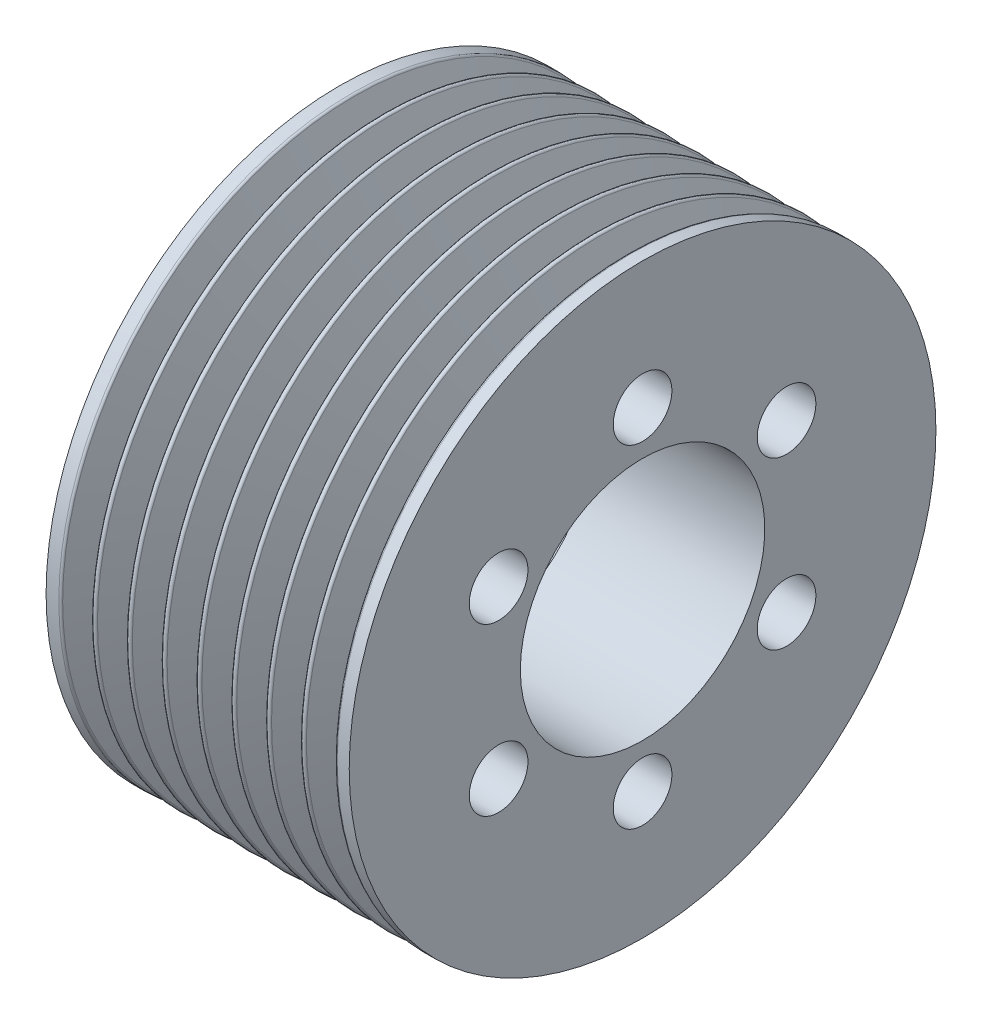
ISO-10303-21;
HEADER;
FILE_DESCRIPTION(('STEP AP214'),'2;1');
FILE_NAME('part.step','',(''),(''),'','','');
FILE_SCHEMA(('AUTOMOTIVE_DESIGN { 1 0 10303 214 1 1 1 1 }'));
ENDSEC;
DATA;
#1=APPLICATION_CONTEXT('core data for automotive mechanical design processes');
#2=APPLICATION_PROTOCOL_DEFINITION('international standard','automotive_design',2000,#1);
#3=PRODUCT_CONTEXT('',#1,'mechanical');
#4=PRODUCT('Part','Part','',(#3));
#5=PRODUCT_RELATED_PRODUCT_CATEGORY('part','',(#4));
#6=PRODUCT_DEFINITION_FORMATION('','',#4);
#7=PRODUCT_DEFINITION_CONTEXT('part definition',#1,'design');
#8=PRODUCT_DEFINITION('design','',#6,#7);
#9=PRODUCT_DEFINITION_SHAPE('','',#8);
#10=(LENGTH_UNIT() NAMED_UNIT(*) SI_UNIT(.MILLI.,.METRE.));
#11=(NAMED_UNIT(*) PLANE_ANGLE_UNIT() SI_UNIT($,.RADIAN.));
#12=(NAMED_UNIT(*) SI_UNIT($,.STERADIAN.) SOLID_ANGLE_UNIT());
#13=UNCERTAINTY_MEASURE_WITH_UNIT(LENGTH_MEASURE(1.E-05),#10,'distance_accuracy_value','');
#14=(GEOMETRIC_REPRESENTATION_CONTEXT(3) GLOBAL_UNCERTAINTY_ASSIGNED_CONTEXT((#13)) GLOBAL_UNIT_ASSIGNED_CONTEXT((#10,
#11,#12)) REPRESENTATION_CONTEXT('',''));
#15=CARTESIAN_POINT('',(0.,0.,0.));
#16=DIRECTION('',(0.,0.,1.));
#17=DIRECTION('',(1.,0.,0.));
#18=AXIS2_PLACEMENT_3D('',#15,#16,#17);
#19=CARTESIAN_POINT('',(0.,0.,0.));
#20=DIRECTION('',(-1.,0.,0.));
#21=DIRECTION('',(0.,0.,1.));
#22=AXIS2_PLACEMENT_3D('',#19,#20,#21);
#23=CYLINDRICAL_SURFACE('',#22,30.);
#24=CARTESIAN_POINT('',(18.,0.,0.));
#25=DIRECTION('',(-1.,0.,0.));
#26=DIRECTION('',(0.,0.,1.));
#27=AXIS2_PLACEMENT_3D('',#24,#25,#26);
#28=CIRCLE('',#27,30.);
#29=CARTESIAN_POINT('',(18.,0.,30.));
#30=VERTEX_POINT('',#29);
#31=EDGE_CURVE('E59',#30,#30,#28,.T.);
#32=ORIENTED_EDGE('',*,*,#31,.F.);
#33=EDGE_LOOP('',(#32));
#34=FACE_BOUND('',#33,.T.);
#35=CARTESIAN_POINT('',(19.3,0.,0.));
#36=DIRECTION('',(-1.,0.,0.));
#37=DIRECTION('',(0.,0.,1.));
#38=AXIS2_PLACEMENT_3D('',#35,#36,#37);
#39=CIRCLE('',#38,30.);
#40=CARTESIAN_POINT('',(19.3,0.,30.));
#41=VERTEX_POINT('',#40);
#42=EDGE_CURVE('E210',#41,#41,#39,.T.);
#43=ORIENTED_EDGE('',*,*,#42,.T.);
#44=EDGE_LOOP('',(#43));
#45=FACE_BOUND('',#44,.T.);
#46=ADVANCED_FACE('F45',(#34,#45),#23,.T.);
#47=CARTESIAN_POINT('',(31.5,12.5,0.));
#48=DIRECTION('',(1.,0.,0.));
#49=DIRECTION('',(0.,0.,-1.));
#50=AXIS2_PLACEMENT_3D('',#47,#48,#49);
#51=PLANE('',#50);
#52=CARTESIAN_POINT('',(31.5,8.50000000000017,14.7224318643354));
#53=DIRECTION('',(1.,0.,0.));
#54=DIRECTION('',(0.,0.,-1.));
#55=AXIS2_PLACEMENT_3D('',#52,#53,#54);
#56=CIRCLE('',#55,3.);
#57=CARTESIAN_POINT('',(31.5,8.50000000000017,11.7224318643354));
#58=VERTEX_POINT('',#57);
#59=EDGE_CURVE('E254',#58,#58,#56,.F.);
#60=ORIENTED_EDGE('',*,*,#59,.F.);
#61=EDGE_LOOP('',(#60));
#62=FACE_BOUND('',#61,.T.);
#63=CARTESIAN_POINT('',(31.5,-8.50000000000004,14.7224318643355));
#64=DIRECTION('',(1.,0.,0.));
#65=DIRECTION('',(0.,0.,-1.));
#66=AXIS2_PLACEMENT_3D('',#63,#64,#65);
#67=CIRCLE('',#66,3.);
#68=CARTESIAN_POINT('',(31.5,-8.50000000000004,11.7224318643355));
#69=VERTEX_POINT('',#68);
#70=EDGE_CURVE('E246',#69,#69,#67,.F.);
#71=ORIENTED_EDGE('',*,*,#70,.F.);
#72=EDGE_LOOP('',(#71));
#73=FACE_BOUND('',#72,.T.);
#74=CARTESIAN_POINT('',(31.5,-17.0000000000001,0.));
#75=DIRECTION('',(1.,0.,0.));
#76=DIRECTION('',(0.,0.,-1.));
#77=AXIS2_PLACEMENT_3D('',#74,#75,#76);
#78=CIRCLE('',#77,3.);
#79=CARTESIAN_POINT('',(31.5,-17.0000000000001,-2.99999999999996));
#80=VERTEX_POINT('',#79);
#81=EDGE_CURVE('E238',#80,#80,#78,.F.);
#82=ORIENTED_EDGE('',*,*,#81,.F.);
#83=EDGE_LOOP('',(#82));
#84=FACE_BOUND('',#83,.T.);
#85=CARTESIAN_POINT('',(31.5,-8.49999999999999,-14.7224318643355));
#86=DIRECTION('',(1.,0.,0.));
#87=DIRECTION('',(0.,0.,-1.));
#88=AXIS2_PLACEMENT_3D('',#85,#86,#87);
#89=CIRCLE('',#88,3.);
#90=CARTESIAN_POINT('',(31.5,-8.49999999999999,-17.7224318643355));
#91=VERTEX_POINT('',#90);
#92=EDGE_CURVE('E230',#91,#91,#89,.F.);
#93=ORIENTED_EDGE('',*,*,#92,.F.);
#94=EDGE_LOOP('',(#93));
#95=FACE_BOUND('',#94,.T.);
#96=CARTESIAN_POINT('',(31.5,8.5,-14.7224318643355));
#97=DIRECTION('',(1.,0.,0.));
#98=DIRECTION('',(0.,0.,-1.));
#99=AXIS2_PLACEMENT_3D('',#96,#97,#98);
#100=CIRCLE('',#99,3.);
#101=CARTESIAN_POINT('',(31.5,8.5,-17.7224318643355));
#102=VERTEX_POINT('',#101);
#103=EDGE_CURVE('E222',#102,#102,#100,.F.);
#104=ORIENTED_EDGE('',*,*,#103,.F.);
#105=EDGE_LOOP('',(#104));
#106=FACE_BOUND('',#105,.T.);
#107=CARTESIAN_POINT('',(31.5,17.,0.));
#108=DIRECTION('',(1.,0.,0.));
#109=DIRECTION('',(0.,0.,-1.));
#110=AXIS2_PLACEMENT_3D('',#107,#108,#109);
#111=CIRCLE('',#110,3.);
#112=CARTESIAN_POINT('',(31.5,17.,-3.));
#113=VERTEX_POINT('',#112);
#114=EDGE_CURVE('E214',#113,#113,#111,.F.);
#115=ORIENTED_EDGE('',*,*,#114,.F.);
#116=EDGE_LOOP('',(#115));
#117=FACE_BOUND('',#116,.T.);
#118=CARTESIAN_POINT('',(31.5,0.,0.));
#119=DIRECTION('',(-1.,0.,0.));
#120=DIRECTION('',(0.,0.,1.));
#121=AXIS2_PLACEMENT_3D('',#118,#119,#120);
#122=CIRCLE('',#121,12.5);
#123=CARTESIAN_POINT('',(31.5,0.,12.5));
#124=VERTEX_POINT('',#123);
#125=EDGE_CURVE('E74',#124,#124,#122,.T.);
#126=ORIENTED_EDGE('',*,*,#125,.F.);
#127=EDGE_LOOP('',(#126));
#128=FACE_BOUND('',#127,.T.);
#129=CARTESIAN_POINT('',(31.5,0.,0.));
#130=DIRECTION('',(-1.,0.,0.));
#131=DIRECTION('',(0.,0.,1.));
#132=AXIS2_PLACEMENT_3D('',#129,#130,#131);
#133=CIRCLE('',#132,21.5);
#134=CARTESIAN_POINT('',(31.5,0.,21.5));
#135=VERTEX_POINT('',#134);
#136=EDGE_CURVE('E10',#135,#135,#133,.T.);
#137=ORIENTED_EDGE('',*,*,#136,.T.);
#138=EDGE_LOOP('',(#137));
#139=FACE_BOUND('',#138,.T.);
#140=ADVANCED_FACE('F48',(#62,#73,#84,#95,#106,#117,#128,#139),#51,.F.);
#141=CARTESIAN_POINT('',(0.,0.,0.));
#142=DIRECTION('',(-1.,0.,0.));
#143=DIRECTION('',(0.,0.,1.));
#144=AXIS2_PLACEMENT_3D('',#141,#142,#143);
#145=CYLINDRICAL_SURFACE('',#144,21.5);
#146=ORIENTED_EDGE('',*,*,#136,.F.);
#147=EDGE_LOOP('',(#146));
#148=FACE_BOUND('',#147,.T.);
#149=CARTESIAN_POINT('',(18.,0.,0.));
#150=DIRECTION('',(-1.,0.,0.));
#151=DIRECTION('',(0.,0.,1.));
#152=AXIS2_PLACEMENT_3D('',#149,#150,#151);
#153=CIRCLE('',#152,21.5);
#154=CARTESIAN_POINT('',(18.,0.,21.5));
#155=VERTEX_POINT('',#154);
#156=EDGE_CURVE('E54',#155,#155,#153,.T.);
#157=ORIENTED_EDGE('',*,*,#156,.T.);
#158=EDGE_LOOP('',(#157));
#159=FACE_BOUND('',#158,.T.);
#160=ADVANCED_FACE('F292',(#148,#159),#145,.F.);
#161=CARTESIAN_POINT('',(18.,30.,0.));
#162=DIRECTION('',(1.,0.,0.));
#163=DIRECTION('',(0.,0.,-1.));
#164=AXIS2_PLACEMENT_3D('',#161,#162,#163);
#165=PLANE('',#164);
#166=ORIENTED_EDGE('',*,*,#156,.F.);
#167=EDGE_LOOP('',(#166));
#168=FACE_BOUND('',#167,.T.);
#169=ORIENTED_EDGE('',*,*,#31,.T.);
#170=EDGE_LOOP('',(#169));
#171=FACE_BOUND('',#170,.T.);
#172=ADVANCED_FACE('F298',(#168,#171),#165,.F.);
#173=CARTESIAN_POINT('',(47.78,0.,0.));
#174=DIRECTION('',(-1.,0.,0.));
#175=DIRECTION('',(0.,0.,1.));
#176=AXIS2_PLACEMENT_3D('',#173,#174,#175);
#177=CIRCLE('',#176,30.);
#178=CARTESIAN_POINT('',(47.78,0.,30.));
#179=VERTEX_POINT('',#178);
#180=EDGE_CURVE('E94',#179,#179,#177,.T.);
#181=ORIENTED_EDGE('',*,*,#180,.F.);
#182=EDGE_LOOP('',(#181));
#183=FACE_BOUND('',#182,.T.);
#184=CARTESIAN_POINT('',(49.,0.,0.));
#185=DIRECTION('',(-1.,0.,0.));
#186=DIRECTION('',(0.,0.,1.));
#187=AXIS2_PLACEMENT_3D('',#184,#185,#186);
#188=CIRCLE('',#187,30.);
#189=CARTESIAN_POINT('',(49.,0.,30.));
#190=VERTEX_POINT('',#189);
#191=EDGE_CURVE('E64',#190,#190,#188,.T.);
#192=ORIENTED_EDGE('',*,*,#191,.T.);
#193=EDGE_LOOP('',(#192));
#194=FACE_BOUND('',#193,.T.);
#195=ADVANCED_FACE('F269',(#183,#194),#23,.T.);
#196=CARTESIAN_POINT('',(49.,12.5,0.));
#197=DIRECTION('',(-1.,0.,0.));
#198=DIRECTION('',(0.,0.,1.));
#199=AXIS2_PLACEMENT_3D('',#196,#197,#198);
#200=PLANE('',#199);
#201=CARTESIAN_POINT('',(49.,8.50000000000017,14.7224318643354));
#202=DIRECTION('',(1.,0.,0.));
#203=DIRECTION('',(0.,0.,-1.));
#204=AXIS2_PLACEMENT_3D('',#201,#202,#203);
#205=CIRCLE('',#204,3.);
#206=CARTESIAN_POINT('',(49.,8.50000000000017,11.7224318643354));
#207=VERTEX_POINT('',#206);
#208=EDGE_CURVE('E258',#207,#207,#205,.T.);
#209=ORIENTED_EDGE('',*,*,#208,.F.);
#210=EDGE_LOOP('',(#209));
#211=FACE_BOUND('',#210,.T.);
#212=CARTESIAN_POINT('',(49.,-8.50000000000004,14.7224318643355));
#213=DIRECTION('',(1.,0.,0.));
#214=DIRECTION('',(0.,0.,-1.));
#215=AXIS2_PLACEMENT_3D('',#212,#213,#214);
#216=CIRCLE('',#215,3.);
#217=CARTESIAN_POINT('',(49.,-8.50000000000004,11.7224318643355));
#218=VERTEX_POINT('',#217);
#219=EDGE_CURVE('E250',#218,#218,#216,.T.);
#220=ORIENTED_EDGE('',*,*,#219,.F.);
#221=EDGE_LOOP('',(#220));
#222=FACE_BOUND('',#221,.T.);
#223=CARTESIAN_POINT('',(49.,-17.0000000000001,0.));
#224=DIRECTION('',(1.,0.,0.));
#225=DIRECTION('',(0.,0.,-1.));
#226=AXIS2_PLACEMENT_3D('',#223,#224,#225);
#227=CIRCLE('',#226,3.);
#228=CARTESIAN_POINT('',(49.,-17.0000000000001,-2.99999999999996));
#229=VERTEX_POINT('',#228);
#230=EDGE_CURVE('E242',#229,#229,#227,.T.);
#231=ORIENTED_EDGE('',*,*,#230,.F.);
#232=EDGE_LOOP('',(#231));
#233=FACE_BOUND('',#232,.T.);
#234=CARTESIAN_POINT('',(49.,-8.49999999999999,-14.7224318643355));
#235=DIRECTION('',(1.,0.,0.));
#236=DIRECTION('',(0.,0.,-1.));
#237=AXIS2_PLACEMENT_3D('',#234,#235,#236);
#238=CIRCLE('',#237,3.);
#239=CARTESIAN_POINT('',(49.,-8.49999999999999,-17.7224318643355));
#240=VERTEX_POINT('',#239);
#241=EDGE_CURVE('E234',#240,#240,#238,.T.);
#242=ORIENTED_EDGE('',*,*,#241,.F.);
#243=EDGE_LOOP('',(#242));
#244=FACE_BOUND('',#243,.T.);
#245=CARTESIAN_POINT('',(49.,8.5,-14.7224318643355));
#246=DIRECTION('',(1.,0.,0.));
#247=DIRECTION('',(0.,0.,-1.));
#248=AXIS2_PLACEMENT_3D('',#245,#246,#247);
#249=CIRCLE('',#248,3.);
#250=CARTESIAN_POINT('',(49.,8.5,-17.7224318643355));
#251=VERTEX_POINT('',#250);
#252=EDGE_CURVE('E226',#251,#251,#249,.T.);
#253=ORIENTED_EDGE('',*,*,#252,.F.);
#254=EDGE_LOOP('',(#253));
#255=FACE_BOUND('',#254,.T.);
#256=CARTESIAN_POINT('',(49.,17.,0.));
#257=DIRECTION('',(1.,0.,0.));
#258=DIRECTION('',(0.,0.,-1.));
#259=AXIS2_PLACEMENT_3D('',#256,#257,#258);
#260=CIRCLE('',#259,3.);
#261=CARTESIAN_POINT('',(49.,17.,-3.));
#262=VERTEX_POINT('',#261);
#263=EDGE_CURVE('E218',#262,#262,#260,.T.);
#264=ORIENTED_EDGE('',*,*,#263,.F.);
#265=EDGE_LOOP('',(#264));
#266=FACE_BOUND('',#265,.T.);
#267=ORIENTED_EDGE('',*,*,#191,.F.);
#268=EDGE_LOOP('',(#267));
#269=FACE_BOUND('',#268,.T.);
#270=CARTESIAN_POINT('',(49.,0.,0.));
#271=DIRECTION('',(-1.,0.,0.));
#272=DIRECTION('',(0.,0.,1.));
#273=AXIS2_PLACEMENT_3D('',#270,#271,#272);
#274=CIRCLE('',#273,12.5);
#275=CARTESIAN_POINT('',(49.,0.,12.5));
#276=VERTEX_POINT('',#275);
#277=EDGE_CURVE('E70',#276,#276,#274,.T.);
#278=ORIENTED_EDGE('',*,*,#277,.T.);
#279=EDGE_LOOP('',(#278));
#280=FACE_BOUND('',#279,.T.);
#281=ADVANCED_FACE('F265',(#211,#222,#233,#244,#255,#266,#269,#280),#200,.F.);
#282=CARTESIAN_POINT('',(0.,0.,0.));
#283=DIRECTION('',(-1.,0.,0.));
#284=DIRECTION('',(0.,0.,1.));
#285=AXIS2_PLACEMENT_3D('',#282,#283,#284);
#286=CYLINDRICAL_SURFACE('',#285,12.5);
#287=ORIENTED_EDGE('',*,*,#277,.F.);
#288=EDGE_LOOP('',(#287));
#289=FACE_BOUND('',#288,.T.);
#290=ORIENTED_EDGE('',*,*,#125,.T.);
#291=EDGE_LOOP('',(#290));
#292=FACE_BOUND('',#291,.T.);
#293=ADVANCED_FACE('F268',(#289,#292),#286,.F.);
#294=CARTESIAN_POINT('',(47.78,0.,0.));
#295=DIRECTION('',(-1.,0.,0.));
#296=DIRECTION('',(0.,0.,1.));
#297=AXIS2_PLACEMENT_3D('',#294,#295,#296);
#298=TOROIDAL_SURFACE('',#297,29.75,0.249999999999997);
#299=ORIENTED_EDGE('',*,*,#180,.T.);
#300=EDGE_LOOP('',(#299));
#301=FACE_BOUND('',#300,.T.);
#302=CARTESIAN_POINT('',(47.5458319526879,0.,0.));
#303=DIRECTION('',(-1.,0.,0.));
#304=DIRECTION('',(0.,0.,1.));
#305=AXIS2_PLACEMENT_3D('',#302,#303,#304);
#306=CIRCLE('',#305,29.8375518453149);
#307=CARTESIAN_POINT('',(47.5458319526879,0.,29.8375518453149));
#308=VERTEX_POINT('',#307);
#309=EDGE_CURVE('E78',#308,#308,#306,.T.);
#310=ORIENTED_EDGE('',*,*,#309,.F.);
#311=EDGE_LOOP('',(#310));
#312=FACE_BOUND('',#311,.T.);
#313=ADVANCED_FACE('F287',(#301,#312),#298,.T.);
#314=CARTESIAN_POINT('',(46.2810016567745,0.,0.));
#315=DIRECTION('',(1.,0.,0.));
#316=DIRECTION('',(0.,0.,-1.));
#317=AXIS2_PLACEMENT_3D('',#314,#315,#316);
#318=CONICAL_SURFACE('',#317,26.4546095496951,1.21300383013606);
#319=ORIENTED_EDGE('',*,*,#309,.T.);
#320=EDGE_LOOP('',(#319));
#321=FACE_BOUND('',#320,.T.);
#322=CARTESIAN_POINT('',(46.2810016567745,0.,0.));
#323=DIRECTION('',(-1.,0.,0.));
#324=DIRECTION('',(0.,0.,1.));
#325=AXIS2_PLACEMENT_3D('',#322,#323,#324);
#326=CIRCLE('',#325,26.4546095496951);
#327=CARTESIAN_POINT('',(46.2810016567745,0.,26.4546095496951));
#328=VERTEX_POINT('',#327);
#329=EDGE_CURVE('E82',#328,#328,#326,.T.);
#330=ORIENTED_EDGE('',*,*,#329,.F.);
#331=EDGE_LOOP('',(#330));
#332=FACE_BOUND('',#331,.T.);
#333=ADVANCED_FACE('F484',(#321,#332),#318,.T.);
#334=CARTESIAN_POINT('',(46.,0.,0.));
#335=DIRECTION('',(-1.,0.,0.));
#336=DIRECTION('',(0.,0.,1.));
#337=AXIS2_PLACEMENT_3D('',#334,#335,#336);
#338=TOROIDAL_SURFACE('',#337,26.5596717640729,0.300000000000001);
#339=ORIENTED_EDGE('',*,*,#329,.T.);
#340=EDGE_LOOP('',(#339));
#341=FACE_BOUND('',#340,.T.);
#342=CARTESIAN_POINT('',(45.7189983432255,0.,0.));
#343=DIRECTION('',(-1.,0.,0.));
#344=DIRECTION('',(0.,0.,1.));
#345=AXIS2_PLACEMENT_3D('',#342,#343,#344);
#346=CIRCLE('',#345,26.4546095496951);
#347=CARTESIAN_POINT('',(45.7189983432255,0.,26.4546095496951));
#348=VERTEX_POINT('',#347);
#349=EDGE_CURVE('E86',#348,#348,#346,.T.);
#350=ORIENTED_EDGE('',*,*,#349,.F.);
#351=EDGE_LOOP('',(#350));
#352=FACE_BOUND('',#351,.T.);
#353=ADVANCED_FACE('F479',(#341,#352),#338,.F.);
#354=CARTESIAN_POINT('',(44.4541680473121,0.,0.));
#355=DIRECTION('',(-1.,0.,0.));
#356=DIRECTION('',(0.,0.,1.));
#357=AXIS2_PLACEMENT_3D('',#354,#355,#356);
#358=CONICAL_SURFACE('',#357,29.8375518453149,1.21300383013606);
#359=ORIENTED_EDGE('',*,*,#349,.T.);
#360=EDGE_LOOP('',(#359));
#361=FACE_BOUND('',#360,.T.);
#362=CARTESIAN_POINT('',(44.4541680473121,0.,0.));
#363=DIRECTION('',(-1.,0.,0.));
#364=DIRECTION('',(0.,0.,1.));
#365=AXIS2_PLACEMENT_3D('',#362,#363,#364);
#366=CIRCLE('',#365,29.8375518453149);
#367=CARTESIAN_POINT('',(44.4541680473121,0.,29.8375518453149));
#368=VERTEX_POINT('',#367);
#369=EDGE_CURVE('E90',#368,#368,#366,.T.);
#370=ORIENTED_EDGE('',*,*,#369,.F.);
#371=EDGE_LOOP('',(#370));
#372=FACE_BOUND('',#371,.T.);
#373=ADVANCED_FACE('F474',(#361,#372),#358,.T.);
#374=CARTESIAN_POINT('',(44.22,0.,0.));
#375=DIRECTION('',(-1.,0.,0.));
#376=DIRECTION('',(0.,0.,1.));
#377=AXIS2_PLACEMENT_3D('',#374,#375,#376);
#378=TOROIDAL_SURFACE('',#377,29.75,0.250000000000004);
#379=ORIENTED_EDGE('',*,*,#369,.T.);
#380=EDGE_LOOP('',(#379));
#381=FACE_BOUND('',#380,.T.);
#382=CARTESIAN_POINT('',(43.9858319526879,0.,0.));
#383=DIRECTION('',(-1.,0.,0.));
#384=DIRECTION('',(0.,0.,1.));
#385=AXIS2_PLACEMENT_3D('',#382,#383,#384);
#386=CIRCLE('',#385,29.8375518453149);
#387=CARTESIAN_POINT('',(43.9858319526879,0.,29.8375518453149));
#388=VERTEX_POINT('',#387);
#389=EDGE_CURVE('E98',#388,#388,#386,.T.);
#390=ORIENTED_EDGE('',*,*,#389,.F.);
#391=EDGE_LOOP('',(#390));
#392=FACE_BOUND('',#391,.T.);
#393=ADVANCED_FACE('F469',(#381,#392),#378,.T.);
#394=CARTESIAN_POINT('',(42.7210016567745,0.,0.));
#395=DIRECTION('',(1.,0.,0.));
#396=DIRECTION('',(0.,0.,-1.));
#397=AXIS2_PLACEMENT_3D('',#394,#395,#396);
#398=CONICAL_SURFACE('',#397,26.4546095496951,1.21300383013606);
#399=ORIENTED_EDGE('',*,*,#389,.T.);
#400=EDGE_LOOP('',(#399));
#401=FACE_BOUND('',#400,.T.);
#402=CARTESIAN_POINT('',(42.7210016567745,0.,0.));
#403=DIRECTION('',(-1.,0.,0.));
#404=DIRECTION('',(0.,0.,1.));
#405=AXIS2_PLACEMENT_3D('',#402,#403,#404);
#406=CIRCLE('',#405,26.4546095496951);
#407=CARTESIAN_POINT('',(42.7210016567745,0.,26.4546095496951));
#408=VERTEX_POINT('',#407);
#409=EDGE_CURVE('E102',#408,#408,#406,.T.);
#410=ORIENTED_EDGE('',*,*,#409,.F.);
#411=EDGE_LOOP('',(#410));
#412=FACE_BOUND('',#411,.T.);
#413=ADVANCED_FACE('F464',(#401,#412),#398,.T.);
#414=CARTESIAN_POINT('',(42.44,0.,0.));
#415=DIRECTION('',(-1.,0.,0.));
#416=DIRECTION('',(0.,0.,1.));
#417=AXIS2_PLACEMENT_3D('',#414,#415,#416);
#418=TOROIDAL_SURFACE('',#417,26.5596717640729,0.300000000000001);
#419=ORIENTED_EDGE('',*,*,#409,.T.);
#420=EDGE_LOOP('',(#419));
#421=FACE_BOUND('',#420,.T.);
#422=CARTESIAN_POINT('',(42.1589983432255,0.,0.));
#423=DIRECTION('',(-1.,0.,0.));
#424=DIRECTION('',(0.,0.,1.));
#425=AXIS2_PLACEMENT_3D('',#422,#423,#424);
#426=CIRCLE('',#425,26.4546095496951);
#427=CARTESIAN_POINT('',(42.1589983432255,0.,26.4546095496951));
#428=VERTEX_POINT('',#427);
#429=EDGE_CURVE('E106',#428,#428,#426,.T.);
#430=ORIENTED_EDGE('',*,*,#429,.F.);
#431=EDGE_LOOP('',(#430));
#432=FACE_BOUND('',#431,.T.);
#433=ADVANCED_FACE('F459',(#421,#432),#418,.F.);
#434=CARTESIAN_POINT('',(40.8941680473121,0.,0.));
#435=DIRECTION('',(-1.,0.,0.));
#436=DIRECTION('',(0.,0.,1.));
#437=AXIS2_PLACEMENT_3D('',#434,#435,#436);
#438=CONICAL_SURFACE('',#437,29.8375518453149,1.21300383013606);
#439=ORIENTED_EDGE('',*,*,#429,.T.);
#440=EDGE_LOOP('',(#439));
#441=FACE_BOUND('',#440,.T.);
#442=CARTESIAN_POINT('',(40.8941680473121,0.,0.));
#443=DIRECTION('',(-1.,0.,0.));
#444=DIRECTION('',(0.,0.,1.));
#445=AXIS2_PLACEMENT_3D('',#442,#443,#444);
#446=CIRCLE('',#445,29.8375518453149);
#447=CARTESIAN_POINT('',(40.8941680473121,0.,29.8375518453149));
#448=VERTEX_POINT('',#447);
#449=EDGE_CURVE('E110',#448,#448,#446,.T.);
#450=ORIENTED_EDGE('',*,*,#449,.F.);
#451=EDGE_LOOP('',(#450));
#452=FACE_BOUND('',#451,.T.);
#453=ADVANCED_FACE('F454',(#441,#452),#438,.T.);
#454=CARTESIAN_POINT('',(40.66,0.,0.));
#455=DIRECTION('',(-1.,0.,0.));
#456=DIRECTION('',(0.,0.,1.));
#457=AXIS2_PLACEMENT_3D('',#454,#455,#456);
#458=TOROIDAL_SURFACE('',#457,29.75,0.250000000000004);
#459=ORIENTED_EDGE('',*,*,#449,.T.);
#460=EDGE_LOOP('',(#459));
#461=FACE_BOUND('',#460,.T.);
#462=CARTESIAN_POINT('',(40.4258319526879,0.,0.));
#463=DIRECTION('',(-1.,0.,0.));
#464=DIRECTION('',(0.,0.,1.));
#465=AXIS2_PLACEMENT_3D('',#462,#463,#464);
#466=CIRCLE('',#465,29.8375518453149);
#467=CARTESIAN_POINT('',(40.4258319526879,0.,29.8375518453149));
#468=VERTEX_POINT('',#467);
#469=EDGE_CURVE('E114',#468,#468,#466,.T.);
#470=ORIENTED_EDGE('',*,*,#469,.F.);
#471=EDGE_LOOP('',(#470));
#472=FACE_BOUND('',#471,.T.);
#473=ADVANCED_FACE('F449',(#461,#472),#458,.T.);
#474=CARTESIAN_POINT('',(39.1610016567745,0.,0.));
#475=DIRECTION('',(1.,0.,0.));
#476=DIRECTION('',(0.,0.,-1.));
#477=AXIS2_PLACEMENT_3D('',#474,#475,#476);
#478=CONICAL_SURFACE('',#477,26.4546095496951,1.21300383013606);
#479=ORIENTED_EDGE('',*,*,#469,.T.);
#480=EDGE_LOOP('',(#479));
#481=FACE_BOUND('',#480,.T.);
#482=CARTESIAN_POINT('',(39.1610016567745,0.,0.));
#483=DIRECTION('',(-1.,0.,0.));
#484=DIRECTION('',(0.,0.,1.));
#485=AXIS2_PLACEMENT_3D('',#482,#483,#484);
#486=CIRCLE('',#485,26.4546095496951);
#487=CARTESIAN_POINT('',(39.1610016567745,0.,26.4546095496951));
#488=VERTEX_POINT('',#487);
#489=EDGE_CURVE('E118',#488,#488,#486,.T.);
#490=ORIENTED_EDGE('',*,*,#489,.F.);
#491=EDGE_LOOP('',(#490));
#492=FACE_BOUND('',#491,.T.);
#493=ADVANCED_FACE('F444',(#481,#492),#478,.T.);
#494=CARTESIAN_POINT('',(38.88,0.,0.));
#495=DIRECTION('',(-1.,0.,0.));
#496=DIRECTION('',(0.,0.,1.));
#497=AXIS2_PLACEMENT_3D('',#494,#495,#496);
#498=TOROIDAL_SURFACE('',#497,26.5596717640729,0.300000000000001);
#499=ORIENTED_EDGE('',*,*,#489,.T.);
#500=EDGE_LOOP('',(#499));
#501=FACE_BOUND('',#500,.T.);
#502=CARTESIAN_POINT('',(38.5989983432255,0.,0.));
#503=DIRECTION('',(-1.,0.,0.));
#504=DIRECTION('',(0.,0.,1.));
#505=AXIS2_PLACEMENT_3D('',#502,#503,#504);
#506=CIRCLE('',#505,26.4546095496951);
#507=CARTESIAN_POINT('',(38.5989983432255,0.,26.4546095496951));
#508=VERTEX_POINT('',#507);
#509=EDGE_CURVE('E122',#508,#508,#506,.T.);
#510=ORIENTED_EDGE('',*,*,#509,.F.);
#511=EDGE_LOOP('',(#510));
#512=FACE_BOUND('',#511,.T.);
#513=ADVANCED_FACE('F439',(#501,#512),#498,.F.);
#514=CARTESIAN_POINT('',(37.3341680473121,0.,0.));
#515=DIRECTION('',(-1.,0.,0.));
#516=DIRECTION('',(0.,0.,1.));
#517=AXIS2_PLACEMENT_3D('',#514,#515,#516);
#518=CONICAL_SURFACE('',#517,29.8375518453149,1.21300383013606);
#519=ORIENTED_EDGE('',*,*,#509,.T.);
#520=EDGE_LOOP('',(#519));
#521=FACE_BOUND('',#520,.T.);
#522=CARTESIAN_POINT('',(37.3341680473121,0.,0.));
#523=DIRECTION('',(-1.,0.,0.));
#524=DIRECTION('',(0.,0.,1.));
#525=AXIS2_PLACEMENT_3D('',#522,#523,#524);
#526=CIRCLE('',#525,29.8375518453149);
#527=CARTESIAN_POINT('',(37.3341680473121,0.,29.8375518453149));
#528=VERTEX_POINT('',#527);
#529=EDGE_CURVE('E126',#528,#528,#526,.T.);
#530=ORIENTED_EDGE('',*,*,#529,.F.);
#531=EDGE_LOOP('',(#530));
#532=FACE_BOUND('',#531,.T.);
#533=ADVANCED_FACE('F434',(#521,#532),#518,.T.);
#534=CARTESIAN_POINT('',(37.1,0.,0.));
#535=DIRECTION('',(-1.,0.,0.));
#536=DIRECTION('',(0.,0.,1.));
#537=AXIS2_PLACEMENT_3D('',#534,#535,#536);
#538=TOROIDAL_SURFACE('',#537,29.75,0.250000000000004);
#539=ORIENTED_EDGE('',*,*,#529,.T.);
#540=EDGE_LOOP('',(#539));
#541=FACE_BOUND('',#540,.T.);
#542=CARTESIAN_POINT('',(36.8658319526879,0.,0.));
#543=DIRECTION('',(-1.,0.,0.));
#544=DIRECTION('',(0.,0.,1.));
#545=AXIS2_PLACEMENT_3D('',#542,#543,#544);
#546=CIRCLE('',#545,29.8375518453149);
#547=CARTESIAN_POINT('',(36.8658319526879,0.,29.8375518453149));
#548=VERTEX_POINT('',#547);
#549=EDGE_CURVE('E130',#548,#548,#546,.T.);
#550=ORIENTED_EDGE('',*,*,#549,.F.);
#551=EDGE_LOOP('',(#550));
#552=FACE_BOUND('',#551,.T.);
#553=ADVANCED_FACE('F429',(#541,#552),#538,.T.);
#554=CARTESIAN_POINT('',(35.6010016567745,0.,0.));
#555=DIRECTION('',(1.,0.,0.));
#556=DIRECTION('',(0.,0.,-1.));
#557=AXIS2_PLACEMENT_3D('',#554,#555,#556);
#558=CONICAL_SURFACE('',#557,26.4546095496951,1.21300383013606);
#559=ORIENTED_EDGE('',*,*,#549,.T.);
#560=EDGE_LOOP('',(#559));
#561=FACE_BOUND('',#560,.T.);
#562=CARTESIAN_POINT('',(35.6010016567745,0.,0.));
#563=DIRECTION('',(-1.,0.,0.));
#564=DIRECTION('',(0.,0.,1.));
#565=AXIS2_PLACEMENT_3D('',#562,#563,#564);
#566=CIRCLE('',#565,26.4546095496951);
#567=CARTESIAN_POINT('',(35.6010016567745,0.,26.4546095496951));
#568=VERTEX_POINT('',#567);
#569=EDGE_CURVE('E134',#568,#568,#566,.T.);
#570=ORIENTED_EDGE('',*,*,#569,.F.);
#571=EDGE_LOOP('',(#570));
#572=FACE_BOUND('',#571,.T.);
#573=ADVANCED_FACE('F424',(#561,#572),#558,.T.);
#574=CARTESIAN_POINT('',(35.32,0.,0.));
#575=DIRECTION('',(-1.,0.,0.));
#576=DIRECTION('',(0.,0.,1.));
#577=AXIS2_PLACEMENT_3D('',#574,#575,#576);
#578=TOROIDAL_SURFACE('',#577,26.5596717640729,0.300000000000001);
#579=ORIENTED_EDGE('',*,*,#569,.T.);
#580=EDGE_LOOP('',(#579));
#581=FACE_BOUND('',#580,.T.);
#582=CARTESIAN_POINT('',(35.0389983432255,0.,0.));
#583=DIRECTION('',(-1.,0.,0.));
#584=DIRECTION('',(0.,0.,1.));
#585=AXIS2_PLACEMENT_3D('',#582,#583,#584);
#586=CIRCLE('',#585,26.4546095496951);
#587=CARTESIAN_POINT('',(35.0389983432255,0.,26.4546095496951));
#588=VERTEX_POINT('',#587);
#589=EDGE_CURVE('E138',#588,#588,#586,.T.);
#590=ORIENTED_EDGE('',*,*,#589,.F.);
#591=EDGE_LOOP('',(#590));
#592=FACE_BOUND('',#591,.T.);
#593=ADVANCED_FACE('F419',(#581,#592),#578,.F.);
#594=CARTESIAN_POINT('',(33.7741680473121,0.,0.));
#595=DIRECTION('',(-1.,0.,0.));
#596=DIRECTION('',(0.,0.,1.));
#597=AXIS2_PLACEMENT_3D('',#594,#595,#596);
#598=CONICAL_SURFACE('',#597,29.8375518453149,1.21300383013606);
#599=ORIENTED_EDGE('',*,*,#589,.T.);
#600=EDGE_LOOP('',(#599));
#601=FACE_BOUND('',#600,.T.);
#602=CARTESIAN_POINT('',(33.7741680473121,0.,0.));
#603=DIRECTION('',(-1.,0.,0.));
#604=DIRECTION('',(0.,0.,1.));
#605=AXIS2_PLACEMENT_3D('',#602,#603,#604);
#606=CIRCLE('',#605,29.8375518453149);
#607=CARTESIAN_POINT('',(33.7741680473121,0.,29.8375518453149));
#608=VERTEX_POINT('',#607);
#609=EDGE_CURVE('E142',#608,#608,#606,.T.);
#610=ORIENTED_EDGE('',*,*,#609,.F.);
#611=EDGE_LOOP('',(#610));
#612=FACE_BOUND('',#611,.T.);
#613=ADVANCED_FACE('F414',(#601,#612),#598,.T.);
#614=CARTESIAN_POINT('',(33.54,0.,0.));
#615=DIRECTION('',(-1.,0.,0.));
#616=DIRECTION('',(0.,0.,1.));
#617=AXIS2_PLACEMENT_3D('',#614,#615,#616);
#618=TOROIDAL_SURFACE('',#617,29.75,0.250000000000004);
#619=ORIENTED_EDGE('',*,*,#609,.T.);
#620=EDGE_LOOP('',(#619));
#621=FACE_BOUND('',#620,.T.);
#622=CARTESIAN_POINT('',(33.3058319526879,0.,0.));
#623=DIRECTION('',(-1.,0.,0.));
#624=DIRECTION('',(0.,0.,1.));
#625=AXIS2_PLACEMENT_3D('',#622,#623,#624);
#626=CIRCLE('',#625,29.8375518453149);
#627=CARTESIAN_POINT('',(33.3058319526879,0.,29.8375518453149));
#628=VERTEX_POINT('',#627);
#629=EDGE_CURVE('E146',#628,#628,#626,.T.);
#630=ORIENTED_EDGE('',*,*,#629,.F.);
#631=EDGE_LOOP('',(#630));
#632=FACE_BOUND('',#631,.T.);
#633=ADVANCED_FACE('F409',(#621,#632),#618,.T.);
#634=CARTESIAN_POINT('',(32.0410016567745,0.,0.));
#635=DIRECTION('',(1.,0.,0.));
#636=DIRECTION('',(0.,0.,-1.));
#637=AXIS2_PLACEMENT_3D('',#634,#635,#636);
#638=CONICAL_SURFACE('',#637,26.4546095496951,1.21300383013606);
#639=ORIENTED_EDGE('',*,*,#629,.T.);
#640=EDGE_LOOP('',(#639));
#641=FACE_BOUND('',#640,.T.);
#642=CARTESIAN_POINT('',(32.0410016567745,0.,0.));
#643=DIRECTION('',(-1.,0.,0.));
#644=DIRECTION('',(0.,0.,1.));
#645=AXIS2_PLACEMENT_3D('',#642,#643,#644);
#646=CIRCLE('',#645,26.4546095496951);
#647=CARTESIAN_POINT('',(32.0410016567745,0.,26.4546095496951));
#648=VERTEX_POINT('',#647);
#649=EDGE_CURVE('E150',#648,#648,#646,.T.);
#650=ORIENTED_EDGE('',*,*,#649,.F.);
#651=EDGE_LOOP('',(#650));
#652=FACE_BOUND('',#651,.T.);
#653=ADVANCED_FACE('F404',(#641,#652),#638,.T.);
#654=CARTESIAN_POINT('',(31.76,0.,0.));
#655=DIRECTION('',(-1.,0.,0.));
#656=DIRECTION('',(0.,0.,1.));
#657=AXIS2_PLACEMENT_3D('',#654,#655,#656);
#658=TOROIDAL_SURFACE('',#657,26.5596717640729,0.300000000000001);
#659=ORIENTED_EDGE('',*,*,#649,.T.);
#660=EDGE_LOOP('',(#659));
#661=FACE_BOUND('',#660,.T.);
#662=CARTESIAN_POINT('',(31.4789983432255,0.,0.));
#663=DIRECTION('',(-1.,0.,0.));
#664=DIRECTION('',(0.,0.,1.));
#665=AXIS2_PLACEMENT_3D('',#662,#663,#664);
#666=CIRCLE('',#665,26.4546095496951);
#667=CARTESIAN_POINT('',(31.4789983432255,0.,26.4546095496951));
#668=VERTEX_POINT('',#667);
#669=EDGE_CURVE('E154',#668,#668,#666,.T.);
#670=ORIENTED_EDGE('',*,*,#669,.F.);
#671=EDGE_LOOP('',(#670));
#672=FACE_BOUND('',#671,.T.);
#673=ADVANCED_FACE('F399',(#661,#672),#658,.F.);
#674=CARTESIAN_POINT('',(30.2141680473121,0.,0.));
#675=DIRECTION('',(-1.,0.,0.));
#676=DIRECTION('',(0.,0.,1.));
#677=AXIS2_PLACEMENT_3D('',#674,#675,#676);
#678=CONICAL_SURFACE('',#677,29.8375518453149,1.21300383013606);
#679=ORIENTED_EDGE('',*,*,#669,.T.);
#680=EDGE_LOOP('',(#679));
#681=FACE_BOUND('',#680,.T.);
#682=CARTESIAN_POINT('',(30.2141680473121,0.,0.));
#683=DIRECTION('',(-1.,0.,0.));
#684=DIRECTION('',(0.,0.,1.));
#685=AXIS2_PLACEMENT_3D('',#682,#683,#684);
#686=CIRCLE('',#685,29.8375518453149);
#687=CARTESIAN_POINT('',(30.2141680473121,0.,29.8375518453149));
#688=VERTEX_POINT('',#687);
#689=EDGE_CURVE('E158',#688,#688,#686,.T.);
#690=ORIENTED_EDGE('',*,*,#689,.F.);
#691=EDGE_LOOP('',(#690));
#692=FACE_BOUND('',#691,.T.);
#693=ADVANCED_FACE('F394',(#681,#692),#678,.T.);
#694=CARTESIAN_POINT('',(29.98,0.,0.));
#695=DIRECTION('',(-1.,0.,0.));
#696=DIRECTION('',(0.,0.,1.));
#697=AXIS2_PLACEMENT_3D('',#694,#695,#696);
#698=TOROIDAL_SURFACE('',#697,29.75,0.250000000000004);
#699=ORIENTED_EDGE('',*,*,#689,.T.);
#700=EDGE_LOOP('',(#699));
#701=FACE_BOUND('',#700,.T.);
#702=CARTESIAN_POINT('',(29.7458319526879,0.,0.));
#703=DIRECTION('',(-1.,0.,0.));
#704=DIRECTION('',(0.,0.,1.));
#705=AXIS2_PLACEMENT_3D('',#702,#703,#704);
#706=CIRCLE('',#705,29.8375518453149);
#707=CARTESIAN_POINT('',(29.7458319526879,0.,29.8375518453149));
#708=VERTEX_POINT('',#707);
#709=EDGE_CURVE('E162',#708,#708,#706,.T.);
#710=ORIENTED_EDGE('',*,*,#709,.F.);
#711=EDGE_LOOP('',(#710));
#712=FACE_BOUND('',#711,.T.);
#713=ADVANCED_FACE('F389',(#701,#712),#698,.T.);
#714=CARTESIAN_POINT('',(28.4810016567745,0.,0.));
#715=DIRECTION('',(1.,0.,0.));
#716=DIRECTION('',(0.,0.,-1.));
#717=AXIS2_PLACEMENT_3D('',#714,#715,#716);
#718=CONICAL_SURFACE('',#717,26.4546095496951,1.21300383013606);
#719=ORIENTED_EDGE('',*,*,#709,.T.);
#720=EDGE_LOOP('',(#719));
#721=FACE_BOUND('',#720,.T.);
#722=CARTESIAN_POINT('',(28.4810016567745,0.,0.));
#723=DIRECTION('',(-1.,0.,0.));
#724=DIRECTION('',(0.,0.,1.));
#725=AXIS2_PLACEMENT_3D('',#722,#723,#724);
#726=CIRCLE('',#725,26.4546095496951);
#727=CARTESIAN_POINT('',(28.4810016567745,0.,26.4546095496951));
#728=VERTEX_POINT('',#727);
#729=EDGE_CURVE('E166',#728,#728,#726,.T.);
#730=ORIENTED_EDGE('',*,*,#729,.F.);
#731=EDGE_LOOP('',(#730));
#732=FACE_BOUND('',#731,.T.);
#733=ADVANCED_FACE('F384',(#721,#732),#718,.T.);
#734=CARTESIAN_POINT('',(28.2,0.,0.));
#735=DIRECTION('',(-1.,0.,0.));
#736=DIRECTION('',(0.,0.,1.));
#737=AXIS2_PLACEMENT_3D('',#734,#735,#736);
#738=TOROIDAL_SURFACE('',#737,26.5596717640729,0.300000000000001);
#739=ORIENTED_EDGE('',*,*,#729,.T.);
#740=EDGE_LOOP('',(#739));
#741=FACE_BOUND('',#740,.T.);
#742=CARTESIAN_POINT('',(27.9189983432255,0.,0.));
#743=DIRECTION('',(-1.,0.,0.));
#744=DIRECTION('',(0.,0.,1.));
#745=AXIS2_PLACEMENT_3D('',#742,#743,#744);
#746=CIRCLE('',#745,26.4546095496951);
#747=CARTESIAN_POINT('',(27.9189983432255,0.,26.4546095496951));
#748=VERTEX_POINT('',#747);
#749=EDGE_CURVE('E170',#748,#748,#746,.T.);
#750=ORIENTED_EDGE('',*,*,#749,.F.);
#751=EDGE_LOOP('',(#750));
#752=FACE_BOUND('',#751,.T.);
#753=ADVANCED_FACE('F379',(#741,#752),#738,.F.);
#754=CARTESIAN_POINT('',(26.6541680473121,0.,0.));
#755=DIRECTION('',(-1.,0.,0.));
#756=DIRECTION('',(0.,0.,1.));
#757=AXIS2_PLACEMENT_3D('',#754,#755,#756);
#758=CONICAL_SURFACE('',#757,29.8375518453149,1.21300383013606);
#759=ORIENTED_EDGE('',*,*,#749,.T.);
#760=EDGE_LOOP('',(#759));
#761=FACE_BOUND('',#760,.T.);
#762=CARTESIAN_POINT('',(26.6541680473121,0.,0.));
#763=DIRECTION('',(-1.,0.,0.));
#764=DIRECTION('',(0.,0.,1.));
#765=AXIS2_PLACEMENT_3D('',#762,#763,#764);
#766=CIRCLE('',#765,29.8375518453149);
#767=CARTESIAN_POINT('',(26.6541680473121,0.,29.8375518453149));
#768=VERTEX_POINT('',#767);
#769=EDGE_CURVE('E174',#768,#768,#766,.T.);
#770=ORIENTED_EDGE('',*,*,#769,.F.);
#771=EDGE_LOOP('',(#770));
#772=FACE_BOUND('',#771,.T.);
#773=ADVANCED_FACE('F374',(#761,#772),#758,.T.);
#774=CARTESIAN_POINT('',(26.42,0.,0.));
#775=DIRECTION('',(-1.,0.,0.));
#776=DIRECTION('',(0.,0.,1.));
#777=AXIS2_PLACEMENT_3D('',#774,#775,#776);
#778=TOROIDAL_SURFACE('',#777,29.75,0.250000000000004);
#779=ORIENTED_EDGE('',*,*,#769,.T.);
#780=EDGE_LOOP('',(#779));
#781=FACE_BOUND('',#780,.T.);
#782=CARTESIAN_POINT('',(26.1858319526879,0.,0.));
#783=DIRECTION('',(-1.,0.,0.));
#784=DIRECTION('',(0.,0.,1.));
#785=AXIS2_PLACEMENT_3D('',#782,#783,#784);
#786=CIRCLE('',#785,29.8375518453149);
#787=CARTESIAN_POINT('',(26.1858319526879,0.,29.8375518453149));
#788=VERTEX_POINT('',#787);
#789=EDGE_CURVE('E178',#788,#788,#786,.T.);
#790=ORIENTED_EDGE('',*,*,#789,.F.);
#791=EDGE_LOOP('',(#790));
#792=FACE_BOUND('',#791,.T.);
#793=ADVANCED_FACE('F369',(#781,#792),#778,.T.);
#794=CARTESIAN_POINT('',(24.9210016567745,0.,0.));
#795=DIRECTION('',(1.,0.,0.));
#796=DIRECTION('',(0.,0.,-1.));
#797=AXIS2_PLACEMENT_3D('',#794,#795,#796);
#798=CONICAL_SURFACE('',#797,26.4546095496951,1.21300383013606);
#799=ORIENTED_EDGE('',*,*,#789,.T.);
#800=EDGE_LOOP('',(#799));
#801=FACE_BOUND('',#800,.T.);
#802=CARTESIAN_POINT('',(24.9210016567745,0.,0.));
#803=DIRECTION('',(-1.,0.,0.));
#804=DIRECTION('',(0.,0.,1.));
#805=AXIS2_PLACEMENT_3D('',#802,#803,#804);
#806=CIRCLE('',#805,26.4546095496951);
#807=CARTESIAN_POINT('',(24.9210016567745,0.,26.4546095496951));
#808=VERTEX_POINT('',#807);
#809=EDGE_CURVE('E182',#808,#808,#806,.T.);
#810=ORIENTED_EDGE('',*,*,#809,.F.);
#811=EDGE_LOOP('',(#810));
#812=FACE_BOUND('',#811,.T.);
#813=ADVANCED_FACE('F364',(#801,#812),#798,.T.);
#814=CARTESIAN_POINT('',(24.64,0.,0.));
#815=DIRECTION('',(-1.,0.,0.));
#816=DIRECTION('',(0.,0.,1.));
#817=AXIS2_PLACEMENT_3D('',#814,#815,#816);
#818=TOROIDAL_SURFACE('',#817,26.5596717640729,0.300000000000001);
#819=ORIENTED_EDGE('',*,*,#809,.T.);
#820=EDGE_LOOP('',(#819));
#821=FACE_BOUND('',#820,.T.);
#822=CARTESIAN_POINT('',(24.3589983432255,0.,0.));
#823=DIRECTION('',(-1.,0.,0.));
#824=DIRECTION('',(0.,0.,1.));
#825=AXIS2_PLACEMENT_3D('',#822,#823,#824);
#826=CIRCLE('',#825,26.4546095496951);
#827=CARTESIAN_POINT('',(24.3589983432255,0.,26.4546095496951));
#828=VERTEX_POINT('',#827);
#829=EDGE_CURVE('E186',#828,#828,#826,.T.);
#830=ORIENTED_EDGE('',*,*,#829,.F.);
#831=EDGE_LOOP('',(#830));
#832=FACE_BOUND('',#831,.T.);
#833=ADVANCED_FACE('F359',(#821,#832),#818,.F.);
#834=CARTESIAN_POINT('',(23.0941680473121,0.,0.));
#835=DIRECTION('',(-1.,0.,0.));
#836=DIRECTION('',(0.,0.,1.));
#837=AXIS2_PLACEMENT_3D('',#834,#835,#836);
#838=CONICAL_SURFACE('',#837,29.8375518453149,1.21300383013606);
#839=ORIENTED_EDGE('',*,*,#829,.T.);
#840=EDGE_LOOP('',(#839));
#841=FACE_BOUND('',#840,.T.);
#842=CARTESIAN_POINT('',(23.0941680473121,0.,0.));
#843=DIRECTION('',(-1.,0.,0.));
#844=DIRECTION('',(0.,0.,1.));
#845=AXIS2_PLACEMENT_3D('',#842,#843,#844);
#846=CIRCLE('',#845,29.8375518453149);
#847=CARTESIAN_POINT('',(23.0941680473121,0.,29.8375518453149));
#848=VERTEX_POINT('',#847);
#849=EDGE_CURVE('E190',#848,#848,#846,.T.);
#850=ORIENTED_EDGE('',*,*,#849,.F.);
#851=EDGE_LOOP('',(#850));
#852=FACE_BOUND('',#851,.T.);
#853=ADVANCED_FACE('F354',(#841,#852),#838,.T.);
#854=CARTESIAN_POINT('',(22.86,0.,0.));
#855=DIRECTION('',(-1.,0.,0.));
#856=DIRECTION('',(0.,0.,1.));
#857=AXIS2_PLACEMENT_3D('',#854,#855,#856);
#858=TOROIDAL_SURFACE('',#857,29.75,0.250000000000004);
#859=ORIENTED_EDGE('',*,*,#849,.T.);
#860=EDGE_LOOP('',(#859));
#861=FACE_BOUND('',#860,.T.);
#862=CARTESIAN_POINT('',(22.6258319526879,0.,0.));
#863=DIRECTION('',(-1.,0.,0.));
#864=DIRECTION('',(0.,0.,1.));
#865=AXIS2_PLACEMENT_3D('',#862,#863,#864);
#866=CIRCLE('',#865,29.8375518453149);
#867=CARTESIAN_POINT('',(22.6258319526879,0.,29.8375518453149));
#868=VERTEX_POINT('',#867);
#869=EDGE_CURVE('E194',#868,#868,#866,.T.);
#870=ORIENTED_EDGE('',*,*,#869,.F.);
#871=EDGE_LOOP('',(#870));
#872=FACE_BOUND('',#871,.T.);
#873=ADVANCED_FACE('F349',(#861,#872),#858,.T.);
#874=CARTESIAN_POINT('',(21.3610016567745,0.,0.));
#875=DIRECTION('',(1.,0.,0.));
#876=DIRECTION('',(0.,0.,-1.));
#877=AXIS2_PLACEMENT_3D('',#874,#875,#876);
#878=CONICAL_SURFACE('',#877,26.4546095496951,1.21300383013606);
#879=ORIENTED_EDGE('',*,*,#869,.T.);
#880=EDGE_LOOP('',(#879));
#881=FACE_BOUND('',#880,.T.);
#882=CARTESIAN_POINT('',(21.3610016567745,0.,0.));
#883=DIRECTION('',(-1.,0.,0.));
#884=DIRECTION('',(0.,0.,1.));
#885=AXIS2_PLACEMENT_3D('',#882,#883,#884);
#886=CIRCLE('',#885,26.4546095496951);
#887=CARTESIAN_POINT('',(21.3610016567745,0.,26.4546095496951));
#888=VERTEX_POINT('',#887);
#889=EDGE_CURVE('E198',#888,#888,#886,.T.);
#890=ORIENTED_EDGE('',*,*,#889,.F.);
#891=EDGE_LOOP('',(#890));
#892=FACE_BOUND('',#891,.T.);
#893=ADVANCED_FACE('F344',(#881,#892),#878,.T.);
#894=CARTESIAN_POINT('',(21.08,0.,0.));
#895=DIRECTION('',(-1.,0.,0.));
#896=DIRECTION('',(0.,0.,1.));
#897=AXIS2_PLACEMENT_3D('',#894,#895,#896);
#898=TOROIDAL_SURFACE('',#897,26.5596717640729,0.300000000000001);
#899=ORIENTED_EDGE('',*,*,#889,.T.);
#900=EDGE_LOOP('',(#899));
#901=FACE_BOUND('',#900,.T.);
#902=CARTESIAN_POINT('',(20.7989983432255,0.,0.));
#903=DIRECTION('',(-1.,0.,0.));
#904=DIRECTION('',(0.,0.,1.));
#905=AXIS2_PLACEMENT_3D('',#902,#903,#904);
#906=CIRCLE('',#905,26.4546095496951);
#907=CARTESIAN_POINT('',(20.7989983432255,0.,26.4546095496951));
#908=VERTEX_POINT('',#907);
#909=EDGE_CURVE('E202',#908,#908,#906,.T.);
#910=ORIENTED_EDGE('',*,*,#909,.F.);
#911=EDGE_LOOP('',(#910));
#912=FACE_BOUND('',#911,.T.);
#913=ADVANCED_FACE('F339',(#901,#912),#898,.F.);
#914=CARTESIAN_POINT('',(19.5341680473121,0.,0.));
#915=DIRECTION('',(-1.,0.,0.));
#916=DIRECTION('',(0.,0.,1.));
#917=AXIS2_PLACEMENT_3D('',#914,#915,#916);
#918=CONICAL_SURFACE('',#917,29.8375518453149,1.21300383013606);
#919=ORIENTED_EDGE('',*,*,#909,.T.);
#920=EDGE_LOOP('',(#919));
#921=FACE_BOUND('',#920,.T.);
#922=CARTESIAN_POINT('',(19.5341680473121,0.,0.));
#923=DIRECTION('',(-1.,0.,0.));
#924=DIRECTION('',(0.,0.,1.));
#925=AXIS2_PLACEMENT_3D('',#922,#923,#924);
#926=CIRCLE('',#925,29.8375518453149);
#927=CARTESIAN_POINT('',(19.5341680473121,0.,29.8375518453149));
#928=VERTEX_POINT('',#927);
#929=EDGE_CURVE('E206',#928,#928,#926,.T.);
#930=ORIENTED_EDGE('',*,*,#929,.F.);
#931=EDGE_LOOP('',(#930));
#932=FACE_BOUND('',#931,.T.);
#933=ADVANCED_FACE('F327',(#921,#932),#918,.T.);
#934=CARTESIAN_POINT('',(19.3,0.,0.));
#935=DIRECTION('',(-1.,0.,0.));
#936=DIRECTION('',(0.,0.,1.));
#937=AXIS2_PLACEMENT_3D('',#934,#935,#936);
#938=TOROIDAL_SURFACE('',#937,29.75,0.250000000000004);
#939=ORIENTED_EDGE('',*,*,#929,.T.);
#940=EDGE_LOOP('',(#939));
#941=FACE_BOUND('',#940,.T.);
#942=ORIENTED_EDGE('',*,*,#42,.F.);
#943=EDGE_LOOP('',(#942));
#944=FACE_BOUND('',#943,.T.);
#945=ADVANCED_FACE('F318',(#941,#944),#938,.T.);
#946=CARTESIAN_POINT('',(23.0147186257614,17.,0.));
#947=DIRECTION('',(1.,0.,0.));
#948=DIRECTION('',(0.,0.,-1.));
#949=AXIS2_PLACEMENT_3D('',#946,#947,#948);
#950=CYLINDRICAL_SURFACE('',#949,3.);
#951=ORIENTED_EDGE('',*,*,#114,.T.);
#952=EDGE_LOOP('',(#951));
#953=FACE_BOUND('',#952,.T.);
#954=ORIENTED_EDGE('',*,*,#263,.T.);
#955=EDGE_LOOP('',(#954));
#956=FACE_BOUND('',#955,.T.);
#957=ADVANCED_FACE('F314',(#953,#956),#950,.F.);
#958=CARTESIAN_POINT('',(23.0147186257614,8.5,-14.7224318643355));
#959=DIRECTION('',(1.,0.,0.));
#960=DIRECTION('',(0.,0.,-1.));
#961=AXIS2_PLACEMENT_3D('',#958,#959,#960);
#962=CYLINDRICAL_SURFACE('',#961,3.);
#963=ORIENTED_EDGE('',*,*,#103,.T.);
#964=EDGE_LOOP('',(#963));
#965=FACE_BOUND('',#964,.T.);
#966=ORIENTED_EDGE('',*,*,#252,.T.);
#967=EDGE_LOOP('',(#966));
#968=FACE_BOUND('',#967,.T.);
#969=ADVANCED_FACE('F317',(#965,#968),#962,.F.);
#970=CARTESIAN_POINT('',(23.0147186257614,-8.49999999999999,-14.7224318643355));
#971=DIRECTION('',(1.,0.,0.));
#972=DIRECTION('',(0.,0.,-1.));
#973=AXIS2_PLACEMENT_3D('',#970,#971,#972);
#974=CYLINDRICAL_SURFACE('',#973,3.);
#975=ORIENTED_EDGE('',*,*,#92,.T.);
#976=EDGE_LOOP('',(#975));
#977=FACE_BOUND('',#976,.T.);
#978=ORIENTED_EDGE('',*,*,#241,.T.);
#979=EDGE_LOOP('',(#978));
#980=FACE_BOUND('',#979,.T.);
#981=ADVANCED_FACE('F324',(#977,#980),#974,.F.);
#982=CARTESIAN_POINT('',(23.0147186257614,-17.0000000000001,0.));
#983=DIRECTION('',(1.,0.,0.));
#984=DIRECTION('',(0.,0.,-1.));
#985=AXIS2_PLACEMENT_3D('',#982,#983,#984);
#986=CYLINDRICAL_SURFACE('',#985,3.);
#987=ORIENTED_EDGE('',*,*,#81,.T.);
#988=EDGE_LOOP('',(#987));
#989=FACE_BOUND('',#988,.T.);
#990=ORIENTED_EDGE('',*,*,#230,.T.);
#991=EDGE_LOOP('',(#990));
#992=FACE_BOUND('',#991,.T.);
#993=ADVANCED_FACE('F634',(#989,#992),#986,.F.);
#994=CARTESIAN_POINT('',(23.0147186257614,-8.50000000000004,14.7224318643355));
#995=DIRECTION('',(1.,0.,0.));
#996=DIRECTION('',(0.,0.,-1.));
#997=AXIS2_PLACEMENT_3D('',#994,#995,#996);
#998=CYLINDRICAL_SURFACE('',#997,3.);
#999=ORIENTED_EDGE('',*,*,#70,.T.);
#1000=EDGE_LOOP('',(#999));
#1001=FACE_BOUND('',#1000,.T.);
#1002=ORIENTED_EDGE('',*,*,#219,.T.);
#1003=EDGE_LOOP('',(#1002));
#1004=FACE_BOUND('',#1003,.T.);
#1005=ADVANCED_FACE('F642',(#1001,#1004),#998,.F.);
#1006=CARTESIAN_POINT('',(23.0147186257614,8.50000000000017,14.7224318643354));
#1007=DIRECTION('',(1.,0.,0.));
#1008=DIRECTION('',(0.,0.,-1.));
#1009=AXIS2_PLACEMENT_3D('',#1006,#1007,#1008);
#1010=CYLINDRICAL_SURFACE('',#1009,3.);
#1011=ORIENTED_EDGE('',*,*,#59,.T.);
#1012=EDGE_LOOP('',(#1011));
#1013=FACE_BOUND('',#1012,.T.);
#1014=ORIENTED_EDGE('',*,*,#208,.T.);
#1015=EDGE_LOOP('',(#1014));
#1016=FACE_BOUND('',#1015,.T.);
#1017=ADVANCED_FACE('F263',(#1013,#1016),#1010,.F.);
#1018=CLOSED_SHELL('',(#46,#140,#160,#172,#195,#281,#293,#313,#333,#353,#373,#393,#413,#433,
#453,#473,#493,#513,#533,#553,#573,#593,#613,#633,#653,#673,#693,#713,#733,#753,#773,#793,#813,
#833,#853,#873,#893,#913,#933,#945,#957,#969,#981,#993,#1005,#1017));
#1019=MANIFOLD_SOLID_BREP('B2',#1018);
#1020=ADVANCED_BREP_SHAPE_REPRESENTATION('',(#18,#1019),#14);
#1021=SHAPE_DEFINITION_REPRESENTATION(#9,#1020);
ENDSEC;
END-ISO-10303-21;
